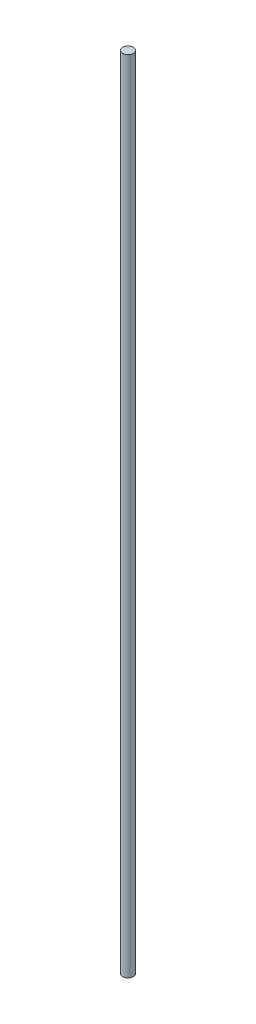
ISO-10303-21;
HEADER;
FILE_DESCRIPTION(('STEP AP214'),'2;1');
FILE_NAME('part.step','',(''),(''),'','','');
FILE_SCHEMA(('AUTOMOTIVE_DESIGN { 1 0 10303 214 1 1 1 1 }'));
ENDSEC;
DATA;
#1=APPLICATION_CONTEXT('core data for automotive mechanical design processes');
#2=APPLICATION_PROTOCOL_DEFINITION('international standard','automotive_design',2000,#1);
#3=PRODUCT_CONTEXT('',#1,'mechanical');
#4=PRODUCT('Part','Part','',(#3));
#5=PRODUCT_RELATED_PRODUCT_CATEGORY('part','',(#4));
#6=PRODUCT_DEFINITION_FORMATION('','',#4);
#7=PRODUCT_DEFINITION_CONTEXT('part definition',#1,'design');
#8=PRODUCT_DEFINITION('design','',#6,#7);
#9=PRODUCT_DEFINITION_SHAPE('','',#8);
#10=(LENGTH_UNIT() NAMED_UNIT(*) SI_UNIT(.MILLI.,.METRE.));
#11=(NAMED_UNIT(*) PLANE_ANGLE_UNIT() SI_UNIT($,.RADIAN.));
#12=(NAMED_UNIT(*) SI_UNIT($,.STERADIAN.) SOLID_ANGLE_UNIT());
#13=UNCERTAINTY_MEASURE_WITH_UNIT(LENGTH_MEASURE(1.E-05),#10,'distance_accuracy_value','');
#14=(GEOMETRIC_REPRESENTATION_CONTEXT(3) GLOBAL_UNCERTAINTY_ASSIGNED_CONTEXT((#13)) GLOBAL_UNIT_ASSIGNED_CONTEXT((#10,
#11,#12)) REPRESENTATION_CONTEXT('',''));
#15=CARTESIAN_POINT('',(0.,0.,0.));
#16=DIRECTION('',(0.,0.,1.));
#17=DIRECTION('',(1.,0.,0.));
#18=AXIS2_PLACEMENT_3D('',#15,#16,#17);
#19=CARTESIAN_POINT('',(0.,750.,0.));
#20=DIRECTION('',(0.,-1.,0.));
#21=DIRECTION('',(0.,0.,-1.));
#22=AXIS2_PLACEMENT_3D('',#19,#20,#21);
#23=CYLINDRICAL_SURFACE('',#22,5.);
#24=CARTESIAN_POINT('',(0.,750.,0.));
#25=DIRECTION('',(0.,1.,0.));
#26=DIRECTION('',(0.,0.,1.));
#27=AXIS2_PLACEMENT_3D('',#24,#25,#26);
#28=CIRCLE('',#27,5.);
#29=CARTESIAN_POINT('',(0.,750.,5.));
#30=VERTEX_POINT('',#29);
#31=EDGE_CURVE('E10',#30,#30,#28,.T.);
#32=ORIENTED_EDGE('',*,*,#31,.F.);
#33=EDGE_LOOP('',(#32));
#34=FACE_BOUND('',#33,.T.);
#35=CARTESIAN_POINT('',(0.,0.,0.));
#36=DIRECTION('',(0.,1.,0.));
#37=DIRECTION('',(0.,0.,1.));
#38=AXIS2_PLACEMENT_3D('',#35,#36,#37);
#39=CIRCLE('',#38,5.);
#40=CARTESIAN_POINT('',(0.,0.,5.));
#41=VERTEX_POINT('',#40);
#42=EDGE_CURVE('E34',#41,#41,#39,.T.);
#43=ORIENTED_EDGE('',*,*,#42,.T.);
#44=EDGE_LOOP('',(#43));
#45=FACE_BOUND('',#44,.T.);
#46=ADVANCED_FACE('F31',(#34,#45),#23,.T.);
#47=CARTESIAN_POINT('',(0.,750.,0.));
#48=DIRECTION('',(0.,1.,0.));
#49=DIRECTION('',(0.,0.,1.));
#50=AXIS2_PLACEMENT_3D('',#47,#48,#49);
#51=PLANE('',#50);
#52=ORIENTED_EDGE('',*,*,#31,.T.);
#53=EDGE_LOOP('',(#52));
#54=FACE_BOUND('',#53,.T.);
#55=ADVANCED_FACE('F46',(#54),#51,.T.);
#56=CARTESIAN_POINT('',(0.,0.,0.));
#57=DIRECTION('',(0.,1.,0.));
#58=DIRECTION('',(0.,0.,1.));
#59=AXIS2_PLACEMENT_3D('',#56,#57,#58);
#60=PLANE('',#59);
#61=ORIENTED_EDGE('',*,*,#42,.F.);
#62=EDGE_LOOP('',(#61));
#63=FACE_BOUND('',#62,.T.);
#64=ADVANCED_FACE('F44',(#63),#60,.F.);
#65=CLOSED_SHELL('',(#46,#55,#64));
#66=MANIFOLD_SOLID_BREP('B2',#65);
#67=ADVANCED_BREP_SHAPE_REPRESENTATION('',(#18,#66),#14);
#68=SHAPE_DEFINITION_REPRESENTATION(#9,#67);
ENDSEC;
END-ISO-10303-21;
